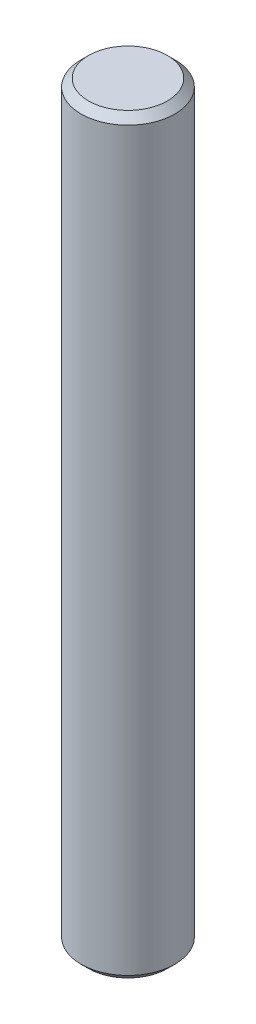
ISO-10303-21;
HEADER;
FILE_DESCRIPTION(('STEP AP214'),'2;1');
FILE_NAME('part.step','',(''),(''),'','','');
FILE_SCHEMA(('AUTOMOTIVE_DESIGN { 1 0 10303 214 1 1 1 1 }'));
ENDSEC;
DATA;
#1=APPLICATION_CONTEXT('core data for automotive mechanical design processes');
#2=APPLICATION_PROTOCOL_DEFINITION('international standard','automotive_design',2000,#1);
#3=PRODUCT_CONTEXT('',#1,'mechanical');
#4=PRODUCT('Part','Part','',(#3));
#5=PRODUCT_RELATED_PRODUCT_CATEGORY('part','',(#4));
#6=PRODUCT_DEFINITION_FORMATION('','',#4);
#7=PRODUCT_DEFINITION_CONTEXT('part definition',#1,'design');
#8=PRODUCT_DEFINITION('design','',#6,#7);
#9=PRODUCT_DEFINITION_SHAPE('','',#8);
#10=(LENGTH_UNIT() NAMED_UNIT(*) SI_UNIT(.MILLI.,.METRE.));
#11=(NAMED_UNIT(*) PLANE_ANGLE_UNIT() SI_UNIT($,.RADIAN.));
#12=(NAMED_UNIT(*) SI_UNIT($,.STERADIAN.) SOLID_ANGLE_UNIT());
#13=UNCERTAINTY_MEASURE_WITH_UNIT(LENGTH_MEASURE(1.E-05),#10,'distance_accuracy_value','');
#14=(GEOMETRIC_REPRESENTATION_CONTEXT(3) GLOBAL_UNCERTAINTY_ASSIGNED_CONTEXT((#13)) GLOBAL_UNIT_ASSIGNED_CONTEXT((#10,
#11,#12)) REPRESENTATION_CONTEXT('',''));
#15=CARTESIAN_POINT('',(0.,0.,0.));
#16=DIRECTION('',(0.,0.,1.));
#17=DIRECTION('',(1.,0.,0.));
#18=AXIS2_PLACEMENT_3D('',#15,#16,#17);
#19=CARTESIAN_POINT('',(0.,200.,0.));
#20=DIRECTION('',(0.,-1.,0.));
#21=DIRECTION('',(0.,0.,-1.));
#22=AXIS2_PLACEMENT_3D('',#19,#20,#21);
#23=CYLINDRICAL_SURFACE('',#22,12.5);
#24=CARTESIAN_POINT('',(0.,2.00000000000003,0.));
#25=DIRECTION('',(0.,1.,0.));
#26=DIRECTION('',(0.,0.,1.));
#27=AXIS2_PLACEMENT_3D('',#24,#25,#26);
#28=CIRCLE('',#27,12.5);
#29=CARTESIAN_POINT('',(0.,2.00000000000003,12.5));
#30=VERTEX_POINT('',#29);
#31=EDGE_CURVE('E51',#30,#30,#28,.T.);
#32=ORIENTED_EDGE('',*,*,#31,.T.);
#33=EDGE_LOOP('',(#32));
#34=FACE_BOUND('',#33,.T.);
#35=CARTESIAN_POINT('',(0.,198.,0.));
#36=DIRECTION('',(0.,1.,0.));
#37=DIRECTION('',(0.,0.,1.));
#38=AXIS2_PLACEMENT_3D('',#35,#36,#37);
#39=CIRCLE('',#38,12.5);
#40=CARTESIAN_POINT('',(0.,198.,12.5));
#41=VERTEX_POINT('',#40);
#42=EDGE_CURVE('E55',#41,#41,#39,.F.);
#43=ORIENTED_EDGE('',*,*,#42,.T.);
#44=EDGE_LOOP('',(#43));
#45=FACE_BOUND('',#44,.T.);
#46=ADVANCED_FACE('F39',(#34,#45),#23,.T.);
#47=CARTESIAN_POINT('',(0.,200.,0.));
#48=DIRECTION('',(0.,1.,0.));
#49=DIRECTION('',(0.,0.,1.));
#50=AXIS2_PLACEMENT_3D('',#47,#48,#49);
#51=PLANE('',#50);
#52=CARTESIAN_POINT('',(0.,200.,0.));
#53=DIRECTION('',(0.,1.,0.));
#54=DIRECTION('',(0.,0.,1.));
#55=AXIS2_PLACEMENT_3D('',#52,#53,#54);
#56=CIRCLE('',#55,10.5);
#57=CARTESIAN_POINT('',(0.,200.,10.5));
#58=VERTEX_POINT('',#57);
#59=EDGE_CURVE('E10',#58,#58,#56,.T.);
#60=ORIENTED_EDGE('',*,*,#59,.T.);
#61=EDGE_LOOP('',(#60));
#62=FACE_BOUND('',#61,.T.);
#63=ADVANCED_FACE('F71',(#62),#51,.T.);
#64=CARTESIAN_POINT('',(0.,0.,0.));
#65=DIRECTION('',(0.,1.,0.));
#66=DIRECTION('',(0.,0.,1.));
#67=AXIS2_PLACEMENT_3D('',#64,#65,#66);
#68=PLANE('',#67);
#69=CARTESIAN_POINT('',(0.,0.,0.));
#70=DIRECTION('',(0.,1.,0.));
#71=DIRECTION('',(0.,0.,1.));
#72=AXIS2_PLACEMENT_3D('',#69,#70,#71);
#73=CIRCLE('',#72,10.5);
#74=CARTESIAN_POINT('',(0.,0.,10.5));
#75=VERTEX_POINT('',#74);
#76=EDGE_CURVE('E47',#75,#75,#73,.F.);
#77=ORIENTED_EDGE('',*,*,#76,.T.);
#78=EDGE_LOOP('',(#77));
#79=FACE_BOUND('',#78,.T.);
#80=ADVANCED_FACE('F68',(#79),#68,.F.);
#81=CARTESIAN_POINT('',(0.,2.00000000000003,0.));
#82=DIRECTION('',(0.,1.,0.));
#83=DIRECTION('',(0.,0.,1.));
#84=AXIS2_PLACEMENT_3D('',#81,#82,#83);
#85=CONICAL_SURFACE('',#84,12.5,0.785398163397446);
#86=ORIENTED_EDGE('',*,*,#76,.F.);
#87=EDGE_LOOP('',(#86));
#88=FACE_BOUND('',#87,.T.);
#89=ORIENTED_EDGE('',*,*,#31,.F.);
#90=EDGE_LOOP('',(#89));
#91=FACE_BOUND('',#90,.T.);
#92=ADVANCED_FACE('F64',(#88,#91),#85,.T.);
#93=CARTESIAN_POINT('',(0.,200.,0.));
#94=DIRECTION('',(0.,-1.,0.));
#95=DIRECTION('',(0.,0.,-1.));
#96=AXIS2_PLACEMENT_3D('',#93,#94,#95);
#97=CONICAL_SURFACE('',#96,10.5,0.785398163397446);
#98=ORIENTED_EDGE('',*,*,#42,.F.);
#99=EDGE_LOOP('',(#98));
#100=FACE_BOUND('',#99,.T.);
#101=ORIENTED_EDGE('',*,*,#59,.F.);
#102=EDGE_LOOP('',(#101));
#103=FACE_BOUND('',#102,.T.);
#104=ADVANCED_FACE('F42',(#100,#103),#97,.T.);
#105=CLOSED_SHELL('',(#46,#63,#80,#92,#104));
#106=MANIFOLD_SOLID_BREP('B2',#105);
#107=ADVANCED_BREP_SHAPE_REPRESENTATION('',(#18,#106),#14);
#108=SHAPE_DEFINITION_REPRESENTATION(#9,#107);
ENDSEC;
END-ISO-10303-21;
